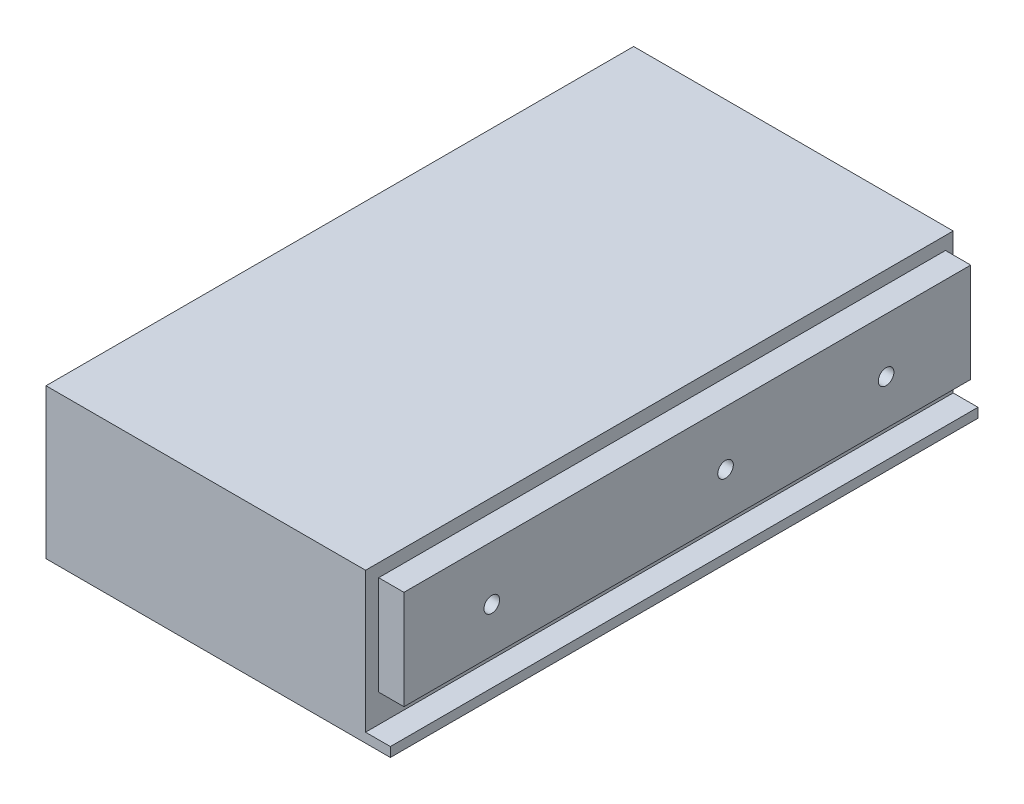
ISO-10303-21;
HEADER;
FILE_DESCRIPTION(('STEP AP214'),'2;1');
FILE_NAME('part.step','',(''),(''),'','','');
FILE_SCHEMA(('AUTOMOTIVE_DESIGN { 1 0 10303 214 1 1 1 1 }'));
ENDSEC;
DATA;
#1=APPLICATION_CONTEXT('core data for automotive mechanical design processes');
#2=APPLICATION_PROTOCOL_DEFINITION('international standard','automotive_design',2000,#1);
#3=PRODUCT_CONTEXT('',#1,'mechanical');
#4=PRODUCT('Part','Part','',(#3));
#5=PRODUCT_RELATED_PRODUCT_CATEGORY('part','',(#4));
#6=PRODUCT_DEFINITION_FORMATION('','',#4);
#7=PRODUCT_DEFINITION_CONTEXT('part definition',#1,'design');
#8=PRODUCT_DEFINITION('design','',#6,#7);
#9=PRODUCT_DEFINITION_SHAPE('','',#8);
#10=(LENGTH_UNIT() NAMED_UNIT(*) SI_UNIT(.MILLI.,.METRE.));
#11=(NAMED_UNIT(*) PLANE_ANGLE_UNIT() SI_UNIT($,.RADIAN.));
#12=(NAMED_UNIT(*) SI_UNIT($,.STERADIAN.) SOLID_ANGLE_UNIT());
#13=UNCERTAINTY_MEASURE_WITH_UNIT(LENGTH_MEASURE(1.E-05),#10,'distance_accuracy_value','');
#14=(GEOMETRIC_REPRESENTATION_CONTEXT(3) GLOBAL_UNCERTAINTY_ASSIGNED_CONTEXT((#13)) GLOBAL_UNIT_ASSIGNED_CONTEXT((#10,
#11,#12)) REPRESENTATION_CONTEXT('',''));
#15=CARTESIAN_POINT('',(0.,0.,0.));
#16=DIRECTION('',(0.,0.,1.));
#17=DIRECTION('',(1.,0.,0.));
#18=AXIS2_PLACEMENT_3D('',#15,#16,#17);
#19=CARTESIAN_POINT('',(23.9903,1.5494,95.6564));
#20=DIRECTION('',(-1.,0.,0.));
#21=DIRECTION('',(0.,0.,1.));
#22=AXIS2_PLACEMENT_3D('',#19,#20,#21);
#23=PLANE('',#22);
#24=DIRECTION('',(0.,1.,0.));
#25=VECTOR('',#24,1.);
#26=CARTESIAN_POINT('',(23.9903,1.5494,0.));
#27=LINE('',#26,#25);
#28=CARTESIAN_POINT('',(23.9903,1.5494,0.));
#29=VERTEX_POINT('',#28);
#30=CARTESIAN_POINT('',(23.9903,24.384,0.));
#31=VERTEX_POINT('',#30);
#32=EDGE_CURVE('E161',#29,#31,#27,.T.);
#33=ORIENTED_EDGE('',*,*,#32,.T.);
#34=DIRECTION('',(0.,0.,-1.));
#35=VECTOR('',#34,1.);
#36=CARTESIAN_POINT('',(23.9903,24.384,95.6564));
#37=LINE('',#36,#35);
#38=CARTESIAN_POINT('',(23.9903,24.384,95.6564));
#39=VERTEX_POINT('',#38);
#40=EDGE_CURVE('E166',#39,#31,#37,.T.);
#41=ORIENTED_EDGE('',*,*,#40,.F.);
#42=DIRECTION('',(0.,1.,0.));
#43=VECTOR('',#42,1.);
#44=CARTESIAN_POINT('',(23.9903,1.5494,95.6564));
#45=LINE('',#44,#43);
#46=CARTESIAN_POINT('',(23.9903,1.5494,95.6564));
#47=VERTEX_POINT('',#46);
#48=EDGE_CURVE('E151',#47,#39,#45,.T.);
#49=ORIENTED_EDGE('',*,*,#48,.F.);
#50=DIRECTION('',(0.,0.,-1.));
#51=VECTOR('',#50,1.);
#52=CARTESIAN_POINT('',(23.9903,1.5494,95.6564));
#53=LINE('',#52,#51);
#54=EDGE_CURVE('E169',#47,#29,#53,.T.);
#55=ORIENTED_EDGE('',*,*,#54,.T.);
#56=EDGE_LOOP('',(#33,#41,#49,#55));
#57=FACE_BOUND('',#56,.T.);
#58=DIRECTION('',(0.,-1.,0.));
#59=VECTOR('',#58,1.);
#60=CARTESIAN_POINT('',(23.9903,22.2631,93.5228));
#61=LINE('',#60,#59);
#62=CARTESIAN_POINT('',(23.9903,22.2631,93.5228));
#63=VERTEX_POINT('',#62);
#64=CARTESIAN_POINT('',(23.9903,6.1341,93.5228));
#65=VERTEX_POINT('',#64);
#66=EDGE_CURVE('E131',#63,#65,#61,.T.);
#67=ORIENTED_EDGE('',*,*,#66,.F.);
#68=DIRECTION('',(0.,0.,1.));
#69=VECTOR('',#68,1.);
#70=CARTESIAN_POINT('',(23.9903,22.2631,93.5228));
#71=LINE('',#70,#69);
#72=CARTESIAN_POINT('',(23.9903,22.2631,1.2573));
#73=VERTEX_POINT('',#72);
#74=EDGE_CURVE('E128',#73,#63,#71,.T.);
#75=ORIENTED_EDGE('',*,*,#74,.F.);
#76=DIRECTION('',(0.,1.,0.));
#77=VECTOR('',#76,1.);
#78=CARTESIAN_POINT('',(23.9903,22.2631,1.2573));
#79=LINE('',#78,#77);
#80=CARTESIAN_POINT('',(23.9903,6.1341,1.2573));
#81=VERTEX_POINT('',#80);
#82=EDGE_CURVE('E53',#81,#73,#79,.T.);
#83=ORIENTED_EDGE('',*,*,#82,.F.);
#84=DIRECTION('',(0.,0.,-1.));
#85=VECTOR('',#84,1.);
#86=CARTESIAN_POINT('',(23.9903,6.1341,93.5228));
#87=LINE('',#86,#85);
#88=EDGE_CURVE('E48',#65,#81,#87,.T.);
#89=ORIENTED_EDGE('',*,*,#88,.F.);
#90=EDGE_LOOP('',(#67,#75,#83,#89));
#91=FACE_BOUND('',#90,.T.);
#92=ADVANCED_FACE('F33',(#57,#91),#23,.F.);
#93=CARTESIAN_POINT('',(-28.0289,24.384,95.6564));
#94=DIRECTION('',(1.,0.,0.));
#95=DIRECTION('',(0.,1.,0.));
#96=AXIS2_PLACEMENT_3D('',#93,#94,#95);
#97=PLANE('',#96);
#98=DIRECTION('',(0.,-1.,0.));
#99=VECTOR('',#98,1.);
#100=CARTESIAN_POINT('',(-28.0289,24.384,0.));
#101=LINE('',#100,#99);
#102=CARTESIAN_POINT('',(-28.0289,24.384,0.));
#103=VERTEX_POINT('',#102);
#104=CARTESIAN_POINT('',(-28.0289,0.,0.));
#105=VERTEX_POINT('',#104);
#106=EDGE_CURVE('E132',#103,#105,#101,.T.);
#107=ORIENTED_EDGE('',*,*,#106,.T.);
#108=DIRECTION('',(0.,0.,-1.));
#109=VECTOR('',#108,1.);
#110=CARTESIAN_POINT('',(-28.0289,0.,95.6564));
#111=LINE('',#110,#109);
#112=CARTESIAN_POINT('',(-28.0289,0.,95.6564));
#113=VERTEX_POINT('',#112);
#114=EDGE_CURVE('E11',#113,#105,#111,.T.);
#115=ORIENTED_EDGE('',*,*,#114,.F.);
#116=DIRECTION('',(0.,-1.,0.));
#117=VECTOR('',#116,1.);
#118=CARTESIAN_POINT('',(-28.0289,24.384,95.6564));
#119=LINE('',#118,#117);
#120=CARTESIAN_POINT('',(-28.0289,24.384,95.6564));
#121=VERTEX_POINT('',#120);
#122=EDGE_CURVE('E141',#121,#113,#119,.T.);
#123=ORIENTED_EDGE('',*,*,#122,.F.);
#124=DIRECTION('',(0.,0.,-1.));
#125=VECTOR('',#124,1.);
#126=CARTESIAN_POINT('',(-28.0289,24.384,95.6564));
#127=LINE('',#126,#125);
#128=EDGE_CURVE('E154',#121,#103,#127,.T.);
#129=ORIENTED_EDGE('',*,*,#128,.T.);
#130=EDGE_LOOP('',(#107,#115,#123,#129));
#131=FACE_BOUND('',#130,.T.);
#132=ADVANCED_FACE('F35',(#131),#97,.F.);
#133=CARTESIAN_POINT('',(-28.0289,0.,95.6564));
#134=DIRECTION('',(0.,1.,0.));
#135=DIRECTION('',(0.,0.,1.));
#136=AXIS2_PLACEMENT_3D('',#133,#134,#135);
#137=PLANE('',#136);
#138=DIRECTION('',(1.,0.,0.));
#139=VECTOR('',#138,1.);
#140=CARTESIAN_POINT('',(-28.0289,0.,0.));
#141=LINE('',#140,#139);
#142=CARTESIAN_POINT('',(28.0289,0.,0.));
#143=VERTEX_POINT('',#142);
#144=EDGE_CURVE('E135',#105,#143,#141,.T.);
#145=ORIENTED_EDGE('',*,*,#144,.T.);
#146=DIRECTION('',(0.,0.,-1.));
#147=VECTOR('',#146,1.);
#148=CARTESIAN_POINT('',(28.0289,0.,95.6564));
#149=LINE('',#148,#147);
#150=CARTESIAN_POINT('',(28.0289,0.,95.6564));
#151=VERTEX_POINT('',#150);
#152=EDGE_CURVE('E41',#151,#143,#149,.T.);
#153=ORIENTED_EDGE('',*,*,#152,.F.);
#154=DIRECTION('',(1.,0.,0.));
#155=VECTOR('',#154,1.);
#156=CARTESIAN_POINT('',(-28.0289,0.,95.6564));
#157=LINE('',#156,#155);
#158=EDGE_CURVE('E144',#113,#151,#157,.T.);
#159=ORIENTED_EDGE('',*,*,#158,.F.);
#160=ORIENTED_EDGE('',*,*,#114,.T.);
#161=EDGE_LOOP('',(#145,#153,#159,#160));
#162=FACE_BOUND('',#161,.T.);
#163=ADVANCED_FACE('F201',(#162),#137,.F.);
#164=CARTESIAN_POINT('',(28.0289,0.,95.6564));
#165=DIRECTION('',(-1.,0.,0.));
#166=DIRECTION('',(0.,-1.,0.));
#167=AXIS2_PLACEMENT_3D('',#164,#165,#166);
#168=PLANE('',#167);
#169=DIRECTION('',(0.,1.,0.));
#170=VECTOR('',#169,1.);
#171=CARTESIAN_POINT('',(28.0289,0.,0.));
#172=LINE('',#171,#170);
#173=CARTESIAN_POINT('',(28.0289,1.5494,0.));
#174=VERTEX_POINT('',#173);
#175=EDGE_CURVE('E157',#143,#174,#172,.T.);
#176=ORIENTED_EDGE('',*,*,#175,.T.);
#177=DIRECTION('',(0.,0.,-1.));
#178=VECTOR('',#177,1.);
#179=CARTESIAN_POINT('',(28.0289,1.5494,95.6564));
#180=LINE('',#179,#178);
#181=CARTESIAN_POINT('',(28.0289,1.5494,95.6564));
#182=VERTEX_POINT('',#181);
#183=EDGE_CURVE('E172',#182,#174,#180,.T.);
#184=ORIENTED_EDGE('',*,*,#183,.F.);
#185=DIRECTION('',(0.,1.,0.));
#186=VECTOR('',#185,1.);
#187=CARTESIAN_POINT('',(28.0289,0.,95.6564));
#188=LINE('',#187,#186);
#189=EDGE_CURVE('E147',#151,#182,#188,.T.);
#190=ORIENTED_EDGE('',*,*,#189,.F.);
#191=ORIENTED_EDGE('',*,*,#152,.T.);
#192=EDGE_LOOP('',(#176,#184,#190,#191));
#193=FACE_BOUND('',#192,.T.);
#194=ADVANCED_FACE('F179',(#193),#168,.F.);
#195=CARTESIAN_POINT('',(28.0289,1.5494,95.6564));
#196=DIRECTION('',(0.,-1.,0.));
#197=DIRECTION('',(1.,0.,0.));
#198=AXIS2_PLACEMENT_3D('',#195,#196,#197);
#199=PLANE('',#198);
#200=DIRECTION('',(-1.,0.,0.));
#201=VECTOR('',#200,1.);
#202=CARTESIAN_POINT('',(28.0289,1.5494,0.));
#203=LINE('',#202,#201);
#204=EDGE_CURVE('E159',#174,#29,#203,.T.);
#205=ORIENTED_EDGE('',*,*,#204,.T.);
#206=ORIENTED_EDGE('',*,*,#54,.F.);
#207=DIRECTION('',(-1.,0.,0.));
#208=VECTOR('',#207,1.);
#209=CARTESIAN_POINT('',(28.0289,1.5494,95.6564));
#210=LINE('',#209,#208);
#211=EDGE_CURVE('E149',#182,#47,#210,.T.);
#212=ORIENTED_EDGE('',*,*,#211,.F.);
#213=ORIENTED_EDGE('',*,*,#183,.T.);
#214=EDGE_LOOP('',(#205,#206,#212,#213));
#215=FACE_BOUND('',#214,.T.);
#216=ADVANCED_FACE('F190',(#215),#199,.F.);
#217=CARTESIAN_POINT('',(23.9903,24.384,95.6564));
#218=DIRECTION('',(0.,-1.,0.));
#219=DIRECTION('',(0.,0.,-1.));
#220=AXIS2_PLACEMENT_3D('',#217,#218,#219);
#221=PLANE('',#220);
#222=DIRECTION('',(-1.,0.,0.));
#223=VECTOR('',#222,1.);
#224=CARTESIAN_POINT('',(23.9903,24.384,0.));
#225=LINE('',#224,#223);
#226=EDGE_CURVE('E145',#31,#103,#225,.T.);
#227=ORIENTED_EDGE('',*,*,#226,.T.);
#228=ORIENTED_EDGE('',*,*,#128,.F.);
#229=DIRECTION('',(-1.,0.,0.));
#230=VECTOR('',#229,1.);
#231=CARTESIAN_POINT('',(23.9903,24.384,95.6564));
#232=LINE('',#231,#230);
#233=EDGE_CURVE('E153',#39,#121,#232,.T.);
#234=ORIENTED_EDGE('',*,*,#233,.F.);
#235=ORIENTED_EDGE('',*,*,#40,.T.);
#236=EDGE_LOOP('',(#227,#228,#234,#235));
#237=FACE_BOUND('',#236,.T.);
#238=ADVANCED_FACE('F204',(#237),#221,.F.);
#239=CARTESIAN_POINT('',(-28.0289,0.,95.6564));
#240=DIRECTION('',(0.,0.,1.));
#241=DIRECTION('',(1.,0.,0.));
#242=AXIS2_PLACEMENT_3D('',#239,#240,#241);
#243=PLANE('',#242);
#244=ORIENTED_EDGE('',*,*,#122,.T.);
#245=ORIENTED_EDGE('',*,*,#158,.T.);
#246=ORIENTED_EDGE('',*,*,#189,.T.);
#247=ORIENTED_EDGE('',*,*,#211,.T.);
#248=ORIENTED_EDGE('',*,*,#48,.T.);
#249=ORIENTED_EDGE('',*,*,#233,.T.);
#250=EDGE_LOOP('',(#244,#245,#246,#247,#248,#249));
#251=FACE_BOUND('',#250,.T.);
#252=ADVANCED_FACE('F197',(#251),#243,.T.);
#253=CARTESIAN_POINT('',(-28.0289,0.,0.));
#254=DIRECTION('',(0.,0.,1.));
#255=DIRECTION('',(1.,0.,0.));
#256=AXIS2_PLACEMENT_3D('',#253,#254,#255);
#257=PLANE('',#256);
#258=ORIENTED_EDGE('',*,*,#106,.F.);
#259=ORIENTED_EDGE('',*,*,#226,.F.);
#260=ORIENTED_EDGE('',*,*,#32,.F.);
#261=ORIENTED_EDGE('',*,*,#204,.F.);
#262=ORIENTED_EDGE('',*,*,#175,.F.);
#263=ORIENTED_EDGE('',*,*,#144,.F.);
#264=EDGE_LOOP('',(#258,#259,#260,#261,#262,#263));
#265=FACE_BOUND('',#264,.T.);
#266=ADVANCED_FACE('F185',(#265),#257,.F.);
#267=CARTESIAN_POINT('',(28.1051,6.1341,93.5228));
#268=DIRECTION('',(1.,0.,0.));
#269=DIRECTION('',(0.,0.,-1.));
#270=AXIS2_PLACEMENT_3D('',#267,#268,#269);
#271=PLANE('',#270);
#272=CARTESIAN_POINT('',(28.1051,13.4239,41.1734));
#273=DIRECTION('',(1.,0.,0.));
#274=DIRECTION('',(0.,0.,-1.));
#275=AXIS2_PLACEMENT_3D('',#272,#273,#274);
#276=CIRCLE('',#275,1.27);
#277=CARTESIAN_POINT('',(28.1051,13.4239,39.9034));
#278=VERTEX_POINT('',#277);
#279=EDGE_CURVE('E242',#278,#278,#276,.T.);
#280=ORIENTED_EDGE('',*,*,#279,.F.);
#281=EDGE_LOOP('',(#280));
#282=FACE_BOUND('',#281,.T.);
#283=DIRECTION('',(0.,-1.,0.));
#284=VECTOR('',#283,1.);
#285=CARTESIAN_POINT('',(28.1051,22.2631,93.5228));
#286=LINE('',#285,#284);
#287=CARTESIAN_POINT('',(28.1051,22.2631,93.5228));
#288=VERTEX_POINT('',#287);
#289=CARTESIAN_POINT('',(28.1051,6.1341,93.5228));
#290=VERTEX_POINT('',#289);
#291=EDGE_CURVE('E118',#288,#290,#286,.T.);
#292=ORIENTED_EDGE('',*,*,#291,.T.);
#293=DIRECTION('',(0.,0.,-1.));
#294=VECTOR('',#293,1.);
#295=CARTESIAN_POINT('',(28.1051,6.1341,93.5228));
#296=LINE('',#295,#294);
#297=CARTESIAN_POINT('',(28.1051,6.1341,1.2573));
#298=VERTEX_POINT('',#297);
#299=EDGE_CURVE('E107',#290,#298,#296,.T.);
#300=ORIENTED_EDGE('',*,*,#299,.T.);
#301=DIRECTION('',(0.,1.,0.));
#302=VECTOR('',#301,1.);
#303=CARTESIAN_POINT('',(28.1051,22.2631,1.2573));
#304=LINE('',#303,#302);
#305=CARTESIAN_POINT('',(28.1051,22.2631,1.2573));
#306=VERTEX_POINT('',#305);
#307=EDGE_CURVE('E117',#298,#306,#304,.T.);
#308=ORIENTED_EDGE('',*,*,#307,.T.);
#309=DIRECTION('',(0.,0.,1.));
#310=VECTOR('',#309,1.);
#311=CARTESIAN_POINT('',(28.1051,22.2631,93.5228));
#312=LINE('',#311,#310);
#313=EDGE_CURVE('E124',#306,#288,#312,.T.);
#314=ORIENTED_EDGE('',*,*,#313,.T.);
#315=EDGE_LOOP('',(#292,#300,#308,#314));
#316=FACE_BOUND('',#315,.T.);
#317=CARTESIAN_POINT('',(28.1051,13.4239,79.2226));
#318=DIRECTION('',(1.,0.,0.));
#319=DIRECTION('',(0.,0.,-1.));
#320=AXIS2_PLACEMENT_3D('',#317,#318,#319);
#321=CIRCLE('',#320,1.26999999999999);
#322=CARTESIAN_POINT('',(28.1051,13.4239,77.9526));
#323=VERTEX_POINT('',#322);
#324=EDGE_CURVE('E253',#323,#323,#321,.T.);
#325=ORIENTED_EDGE('',*,*,#324,.F.);
#326=EDGE_LOOP('',(#325));
#327=FACE_BOUND('',#326,.T.);
#328=CARTESIAN_POINT('',(28.1051,13.4239,15.0368));
#329=DIRECTION('',(1.,0.,0.));
#330=DIRECTION('',(0.,0.,-1.));
#331=AXIS2_PLACEMENT_3D('',#328,#329,#330);
#332=CIRCLE('',#331,1.27);
#333=CARTESIAN_POINT('',(28.1051,13.4239,13.7668));
#334=VERTEX_POINT('',#333);
#335=EDGE_CURVE('E243',#334,#334,#332,.T.);
#336=ORIENTED_EDGE('',*,*,#335,.F.);
#337=EDGE_LOOP('',(#336));
#338=FACE_BOUND('',#337,.T.);
#339=ADVANCED_FACE('F121',(#282,#316,#327,#338),#271,.T.);
#340=CARTESIAN_POINT('',(28.1051,22.2631,93.5228));
#341=DIRECTION('',(0.,0.,-1.));
#342=DIRECTION('',(-1.,0.,0.));
#343=AXIS2_PLACEMENT_3D('',#340,#341,#342);
#344=PLANE('',#343);
#345=ORIENTED_EDGE('',*,*,#66,.T.);
#346=DIRECTION('',(-1.,0.,0.));
#347=VECTOR('',#346,1.);
#348=CARTESIAN_POINT('',(28.1051,6.1341,93.5228));
#349=LINE('',#348,#347);
#350=EDGE_CURVE('E111',#290,#65,#349,.T.);
#351=ORIENTED_EDGE('',*,*,#350,.F.);
#352=ORIENTED_EDGE('',*,*,#291,.F.);
#353=DIRECTION('',(-1.,0.,0.));
#354=VECTOR('',#353,1.);
#355=CARTESIAN_POINT('',(28.1051,22.2631,93.5228));
#356=LINE('',#355,#354);
#357=EDGE_CURVE('E260',#288,#63,#356,.T.);
#358=ORIENTED_EDGE('',*,*,#357,.T.);
#359=EDGE_LOOP('',(#345,#351,#352,#358));
#360=FACE_BOUND('',#359,.T.);
#361=ADVANCED_FACE('F130',(#360),#344,.F.);
#362=CARTESIAN_POINT('',(28.1051,6.1341,93.5228));
#363=DIRECTION('',(0.,1.,0.));
#364=DIRECTION('',(0.,0.,1.));
#365=AXIS2_PLACEMENT_3D('',#362,#363,#364);
#366=PLANE('',#365);
#367=ORIENTED_EDGE('',*,*,#88,.T.);
#368=DIRECTION('',(-1.,0.,0.));
#369=VECTOR('',#368,1.);
#370=CARTESIAN_POINT('',(28.1051,6.1341,1.2573));
#371=LINE('',#370,#369);
#372=EDGE_CURVE('E114',#298,#81,#371,.T.);
#373=ORIENTED_EDGE('',*,*,#372,.F.);
#374=ORIENTED_EDGE('',*,*,#299,.F.);
#375=ORIENTED_EDGE('',*,*,#350,.T.);
#376=EDGE_LOOP('',(#367,#373,#374,#375));
#377=FACE_BOUND('',#376,.T.);
#378=ADVANCED_FACE('F109',(#377),#366,.F.);
#379=CARTESIAN_POINT('',(28.1051,22.2631,1.2573));
#380=DIRECTION('',(0.,0.,1.));
#381=DIRECTION('',(0.,-1.,0.));
#382=AXIS2_PLACEMENT_3D('',#379,#380,#381);
#383=PLANE('',#382);
#384=ORIENTED_EDGE('',*,*,#82,.T.);
#385=DIRECTION('',(-1.,0.,0.));
#386=VECTOR('',#385,1.);
#387=CARTESIAN_POINT('',(28.1051,22.2631,1.2573));
#388=LINE('',#387,#386);
#389=EDGE_CURVE('E137',#306,#73,#388,.T.);
#390=ORIENTED_EDGE('',*,*,#389,.F.);
#391=ORIENTED_EDGE('',*,*,#307,.F.);
#392=ORIENTED_EDGE('',*,*,#372,.T.);
#393=EDGE_LOOP('',(#384,#390,#391,#392));
#394=FACE_BOUND('',#393,.T.);
#395=ADVANCED_FACE('F271',(#394),#383,.F.);
#396=CARTESIAN_POINT('',(28.1051,22.2631,93.5228));
#397=DIRECTION('',(0.,-1.,0.));
#398=DIRECTION('',(0.,0.,-1.));
#399=AXIS2_PLACEMENT_3D('',#396,#397,#398);
#400=PLANE('',#399);
#401=ORIENTED_EDGE('',*,*,#74,.T.);
#402=ORIENTED_EDGE('',*,*,#357,.F.);
#403=ORIENTED_EDGE('',*,*,#313,.F.);
#404=ORIENTED_EDGE('',*,*,#389,.T.);
#405=EDGE_LOOP('',(#401,#402,#403,#404));
#406=FACE_BOUND('',#405,.T.);
#407=ADVANCED_FACE('F269',(#406),#400,.F.);
#408=CARTESIAN_POINT('',(28.1051,13.4239,79.2226));
#409=DIRECTION('',(-1.,0.,0.));
#410=DIRECTION('',(0.,0.,1.));
#411=AXIS2_PLACEMENT_3D('',#408,#409,#410);
#412=CYLINDRICAL_SURFACE('',#411,1.26999999999999);
#413=ORIENTED_EDGE('',*,*,#324,.T.);
#414=EDGE_LOOP('',(#413));
#415=FACE_BOUND('',#414,.T.);
#416=CARTESIAN_POINT('',(23.9903,13.4239,79.2226));
#417=DIRECTION('',(1.,0.,0.));
#418=DIRECTION('',(0.,0.,-1.));
#419=AXIS2_PLACEMENT_3D('',#416,#417,#418);
#420=CIRCLE('',#419,1.26999999999999);
#421=CARTESIAN_POINT('',(23.9903,13.4239,77.9526));
#422=VERTEX_POINT('',#421);
#423=EDGE_CURVE('E246',#422,#422,#420,.T.);
#424=ORIENTED_EDGE('',*,*,#423,.F.);
#425=EDGE_LOOP('',(#424));
#426=FACE_BOUND('',#425,.T.);
#427=ADVANCED_FACE('F278',(#415,#426),#412,.F.);
#428=CARTESIAN_POINT('',(28.1051,13.4239,41.1734));
#429=DIRECTION('',(-1.,0.,0.));
#430=DIRECTION('',(0.,0.,1.));
#431=AXIS2_PLACEMENT_3D('',#428,#429,#430);
#432=CYLINDRICAL_SURFACE('',#431,1.27);
#433=ORIENTED_EDGE('',*,*,#279,.T.);
#434=EDGE_LOOP('',(#433));
#435=FACE_BOUND('',#434,.T.);
#436=CARTESIAN_POINT('',(23.9903,13.4239,41.1734));
#437=DIRECTION('',(1.,0.,0.));
#438=DIRECTION('',(0.,0.,-1.));
#439=AXIS2_PLACEMENT_3D('',#436,#437,#438);
#440=CIRCLE('',#439,1.27);
#441=CARTESIAN_POINT('',(23.9903,13.4239,39.9034));
#442=VERTEX_POINT('',#441);
#443=EDGE_CURVE('E240',#442,#442,#440,.T.);
#444=ORIENTED_EDGE('',*,*,#443,.F.);
#445=EDGE_LOOP('',(#444));
#446=FACE_BOUND('',#445,.T.);
#447=ADVANCED_FACE('F235',(#435,#446),#432,.F.);
#448=CARTESIAN_POINT('',(28.1051,13.4239,15.0368));
#449=DIRECTION('',(-1.,0.,0.));
#450=DIRECTION('',(0.,0.,1.));
#451=AXIS2_PLACEMENT_3D('',#448,#449,#450);
#452=CYLINDRICAL_SURFACE('',#451,1.27);
#453=ORIENTED_EDGE('',*,*,#335,.T.);
#454=EDGE_LOOP('',(#453));
#455=FACE_BOUND('',#454,.T.);
#456=CARTESIAN_POINT('',(23.9903,13.4239,15.0368));
#457=DIRECTION('',(1.,0.,0.));
#458=DIRECTION('',(0.,0.,-1.));
#459=AXIS2_PLACEMENT_3D('',#456,#457,#458);
#460=CIRCLE('',#459,1.27);
#461=CARTESIAN_POINT('',(23.9903,13.4239,13.7668));
#462=VERTEX_POINT('',#461);
#463=EDGE_CURVE('E249',#462,#462,#460,.T.);
#464=ORIENTED_EDGE('',*,*,#463,.F.);
#465=EDGE_LOOP('',(#464));
#466=FACE_BOUND('',#465,.T.);
#467=ADVANCED_FACE('F230',(#455,#466),#452,.F.);
#468=ORIENTED_EDGE('',*,*,#443,.T.);
#469=EDGE_LOOP('',(#468));
#470=FACE_BOUND('',#469,.T.);
#471=ADVANCED_FACE('F222',(#470),#23,.F.);
#472=ORIENTED_EDGE('',*,*,#423,.T.);
#473=EDGE_LOOP('',(#472));
#474=FACE_BOUND('',#473,.T.);
#475=ADVANCED_FACE('F216',(#474),#23,.F.);
#476=ORIENTED_EDGE('',*,*,#463,.T.);
#477=EDGE_LOOP('',(#476));
#478=FACE_BOUND('',#477,.T.);
#479=ADVANCED_FACE('F217',(#478),#23,.F.);
#480=CLOSED_SHELL('',(#92,#132,#163,#194,#216,#238,#252,#266,#339,#361,#378,#395,#407,#427,#447,
#467,#471,#475,#479));
#481=MANIFOLD_SOLID_BREP('B2',#480);
#482=ADVANCED_BREP_SHAPE_REPRESENTATION('',(#18,#481),#14);
#483=SHAPE_DEFINITION_REPRESENTATION(#9,#482);
ENDSEC;
END-ISO-10303-21;
